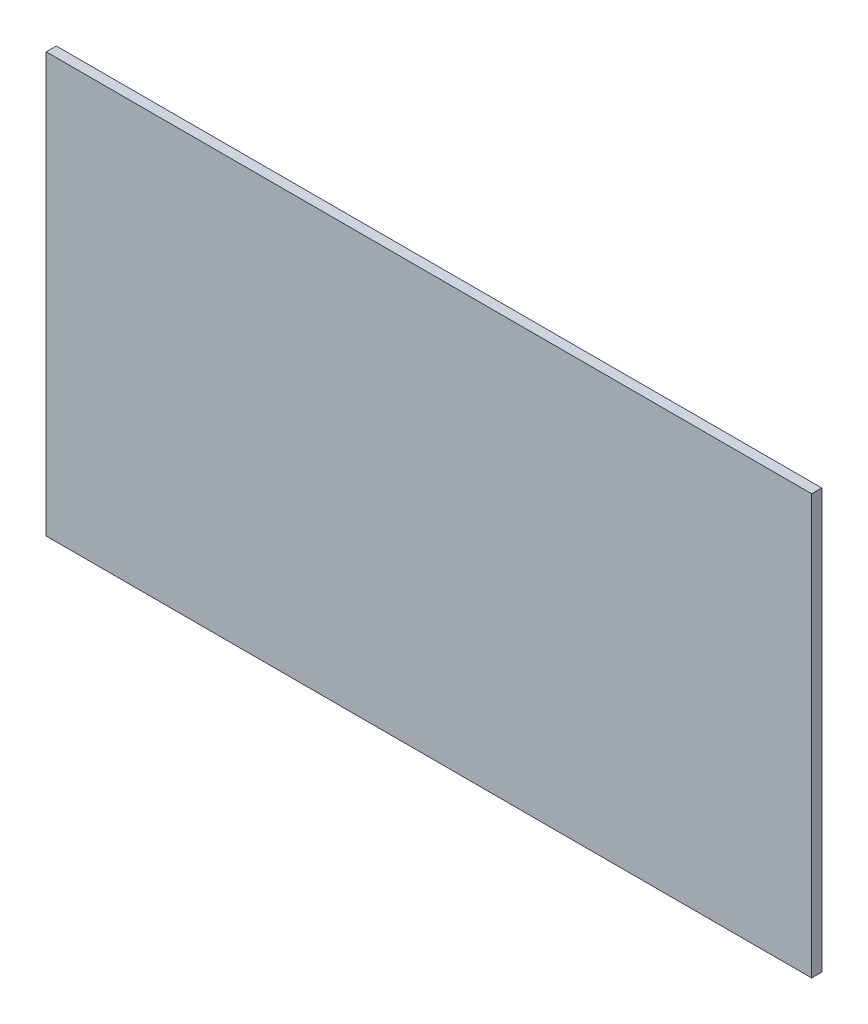
ISO-10303-21;
HEADER;
FILE_DESCRIPTION(('STEP AP214'),'2;1');
FILE_NAME('part.step','',(''),(''),'','','');
FILE_SCHEMA(('AUTOMOTIVE_DESIGN { 1 0 10303 214 1 1 1 1 }'));
ENDSEC;
DATA;
#1=APPLICATION_CONTEXT('core data for automotive mechanical design processes');
#2=APPLICATION_PROTOCOL_DEFINITION('international standard','automotive_design',2000,#1);
#3=PRODUCT_CONTEXT('',#1,'mechanical');
#4=PRODUCT('Part','Part','',(#3));
#5=PRODUCT_RELATED_PRODUCT_CATEGORY('part','',(#4));
#6=PRODUCT_DEFINITION_FORMATION('','',#4);
#7=PRODUCT_DEFINITION_CONTEXT('part definition',#1,'design');
#8=PRODUCT_DEFINITION('design','',#6,#7);
#9=PRODUCT_DEFINITION_SHAPE('','',#8);
#10=(LENGTH_UNIT() NAMED_UNIT(*) SI_UNIT(.MILLI.,.METRE.));
#11=(NAMED_UNIT(*) PLANE_ANGLE_UNIT() SI_UNIT($,.RADIAN.));
#12=(NAMED_UNIT(*) SI_UNIT($,.STERADIAN.) SOLID_ANGLE_UNIT());
#13=UNCERTAINTY_MEASURE_WITH_UNIT(LENGTH_MEASURE(1.E-05),#10,'distance_accuracy_value','');
#14=(GEOMETRIC_REPRESENTATION_CONTEXT(3) GLOBAL_UNCERTAINTY_ASSIGNED_CONTEXT((#13)) GLOBAL_UNIT_ASSIGNED_CONTEXT((#10,
#11,#12)) REPRESENTATION_CONTEXT('',''));
#15=CARTESIAN_POINT('',(0.,0.,0.));
#16=DIRECTION('',(0.,0.,1.));
#17=DIRECTION('',(1.,0.,0.));
#18=AXIS2_PLACEMENT_3D('',#15,#16,#17);
#19=CARTESIAN_POINT('',(0.,0.,2.));
#20=DIRECTION('',(1.,0.,0.));
#21=DIRECTION('',(0.,0.,-1.));
#22=AXIS2_PLACEMENT_3D('',#19,#20,#21);
#23=PLANE('',#22);
#24=DIRECTION('',(0.,-1.,0.));
#25=VECTOR('',#24,1.);
#26=CARTESIAN_POINT('',(0.,0.,0.));
#27=LINE('',#26,#25);
#28=CARTESIAN_POINT('',(0.,83.,0.));
#29=VERTEX_POINT('',#28);
#30=CARTESIAN_POINT('',(0.,0.,0.));
#31=VERTEX_POINT('',#30);
#32=EDGE_CURVE('E97',#29,#31,#27,.T.);
#33=ORIENTED_EDGE('',*,*,#32,.T.);
#34=DIRECTION('',(0.,0.,-1.));
#35=VECTOR('',#34,1.);
#36=CARTESIAN_POINT('',(0.,0.,2.));
#37=LINE('',#36,#35);
#38=CARTESIAN_POINT('',(0.,0.,2.));
#39=VERTEX_POINT('',#38);
#40=EDGE_CURVE('E11',#39,#31,#37,.T.);
#41=ORIENTED_EDGE('',*,*,#40,.F.);
#42=DIRECTION('',(0.,-1.,0.));
#43=VECTOR('',#42,1.);
#44=CARTESIAN_POINT('',(0.,0.,2.));
#45=LINE('',#44,#43);
#46=CARTESIAN_POINT('',(0.,83.,2.));
#47=VERTEX_POINT('',#46);
#48=EDGE_CURVE('E85',#47,#39,#45,.T.);
#49=ORIENTED_EDGE('',*,*,#48,.F.);
#50=DIRECTION('',(0.,0.,-1.));
#51=VECTOR('',#50,1.);
#52=CARTESIAN_POINT('',(0.,83.,2.));
#53=LINE('',#52,#51);
#54=EDGE_CURVE('E93',#47,#29,#53,.T.);
#55=ORIENTED_EDGE('',*,*,#54,.T.);
#56=EDGE_LOOP('',(#33,#41,#49,#55));
#57=FACE_BOUND('',#56,.T.);
#58=ADVANCED_FACE('F34',(#57),#23,.F.);
#59=CARTESIAN_POINT('',(0.,0.,2.));
#60=DIRECTION('',(0.,1.,0.));
#61=DIRECTION('',(0.,0.,1.));
#62=AXIS2_PLACEMENT_3D('',#59,#60,#61);
#63=PLANE('',#62);
#64=DIRECTION('',(1.,0.,0.));
#65=VECTOR('',#64,1.);
#66=CARTESIAN_POINT('',(0.,0.,0.));
#67=LINE('',#66,#65);
#68=CARTESIAN_POINT('',(151.5,0.,0.));
#69=VERTEX_POINT('',#68);
#70=EDGE_CURVE('E89',#31,#69,#67,.T.);
#71=ORIENTED_EDGE('',*,*,#70,.T.);
#72=DIRECTION('',(0.,0.,-1.));
#73=VECTOR('',#72,1.);
#74=CARTESIAN_POINT('',(151.5,0.,2.));
#75=LINE('',#74,#73);
#76=CARTESIAN_POINT('',(151.5,0.,2.));
#77=VERTEX_POINT('',#76);
#78=EDGE_CURVE('E42',#77,#69,#75,.T.);
#79=ORIENTED_EDGE('',*,*,#78,.F.);
#80=DIRECTION('',(1.,0.,0.));
#81=VECTOR('',#80,1.);
#82=CARTESIAN_POINT('',(0.,0.,2.));
#83=LINE('',#82,#81);
#84=EDGE_CURVE('E80',#39,#77,#83,.T.);
#85=ORIENTED_EDGE('',*,*,#84,.F.);
#86=ORIENTED_EDGE('',*,*,#40,.T.);
#87=EDGE_LOOP('',(#71,#79,#85,#86));
#88=FACE_BOUND('',#87,.T.);
#89=ADVANCED_FACE('F88',(#88),#63,.F.);
#90=CARTESIAN_POINT('',(151.5,0.,2.));
#91=DIRECTION('',(-1.,0.,0.));
#92=DIRECTION('',(0.,0.,1.));
#93=AXIS2_PLACEMENT_3D('',#90,#91,#92);
#94=PLANE('',#93);
#95=DIRECTION('',(0.,1.,0.));
#96=VECTOR('',#95,1.);
#97=CARTESIAN_POINT('',(151.5,0.,0.));
#98=LINE('',#97,#96);
#99=CARTESIAN_POINT('',(151.5,83.,0.));
#100=VERTEX_POINT('',#99);
#101=EDGE_CURVE('E67',#69,#100,#98,.T.);
#102=ORIENTED_EDGE('',*,*,#101,.T.);
#103=DIRECTION('',(0.,0.,-1.));
#104=VECTOR('',#103,1.);
#105=CARTESIAN_POINT('',(151.5,83.,2.));
#106=LINE('',#105,#104);
#107=CARTESIAN_POINT('',(151.5,83.,2.));
#108=VERTEX_POINT('',#107);
#109=EDGE_CURVE('E90',#108,#100,#106,.T.);
#110=ORIENTED_EDGE('',*,*,#109,.F.);
#111=DIRECTION('',(0.,1.,0.));
#112=VECTOR('',#111,1.);
#113=CARTESIAN_POINT('',(151.5,0.,2.));
#114=LINE('',#113,#112);
#115=EDGE_CURVE('E83',#77,#108,#114,.T.);
#116=ORIENTED_EDGE('',*,*,#115,.F.);
#117=ORIENTED_EDGE('',*,*,#78,.T.);
#118=EDGE_LOOP('',(#102,#110,#116,#117));
#119=FACE_BOUND('',#118,.T.);
#120=ADVANCED_FACE('F91',(#119),#94,.F.);
#121=CARTESIAN_POINT('',(0.,83.,2.));
#122=DIRECTION('',(0.,-1.,0.));
#123=DIRECTION('',(0.,0.,-1.));
#124=AXIS2_PLACEMENT_3D('',#121,#122,#123);
#125=PLANE('',#124);
#126=DIRECTION('',(-1.,0.,0.));
#127=VECTOR('',#126,1.);
#128=CARTESIAN_POINT('',(0.,83.,0.));
#129=LINE('',#128,#127);
#130=EDGE_CURVE('E73',#100,#29,#129,.T.);
#131=ORIENTED_EDGE('',*,*,#130,.T.);
#132=ORIENTED_EDGE('',*,*,#54,.F.);
#133=DIRECTION('',(-1.,0.,0.));
#134=VECTOR('',#133,1.);
#135=CARTESIAN_POINT('',(0.,83.,2.));
#136=LINE('',#135,#134);
#137=EDGE_CURVE('E50',#108,#47,#136,.T.);
#138=ORIENTED_EDGE('',*,*,#137,.F.);
#139=ORIENTED_EDGE('',*,*,#109,.T.);
#140=EDGE_LOOP('',(#131,#132,#138,#139));
#141=FACE_BOUND('',#140,.T.);
#142=ADVANCED_FACE('F104',(#141),#125,.F.);
#143=CARTESIAN_POINT('',(0.,0.,2.));
#144=DIRECTION('',(0.,0.,-1.));
#145=DIRECTION('',(-1.,0.,0.));
#146=AXIS2_PLACEMENT_3D('',#143,#144,#145);
#147=PLANE('',#146);
#148=ORIENTED_EDGE('',*,*,#48,.T.);
#149=ORIENTED_EDGE('',*,*,#84,.T.);
#150=ORIENTED_EDGE('',*,*,#115,.T.);
#151=ORIENTED_EDGE('',*,*,#137,.T.);
#152=EDGE_LOOP('',(#148,#149,#150,#151));
#153=FACE_BOUND('',#152,.T.);
#154=ADVANCED_FACE('F81',(#153),#147,.F.);
#155=CARTESIAN_POINT('',(0.,0.,0.));
#156=DIRECTION('',(0.,0.,-1.));
#157=DIRECTION('',(-1.,0.,0.));
#158=AXIS2_PLACEMENT_3D('',#155,#156,#157);
#159=PLANE('',#158);
#160=ORIENTED_EDGE('',*,*,#32,.F.);
#161=ORIENTED_EDGE('',*,*,#130,.F.);
#162=ORIENTED_EDGE('',*,*,#101,.F.);
#163=ORIENTED_EDGE('',*,*,#70,.F.);
#164=EDGE_LOOP('',(#160,#161,#162,#163));
#165=FACE_BOUND('',#164,.T.);
#166=ADVANCED_FACE('F107',(#165),#159,.T.);
#167=CLOSED_SHELL('',(#58,#89,#120,#142,#154,#166));
#168=MANIFOLD_SOLID_BREP('B2',#167);
#169=ADVANCED_BREP_SHAPE_REPRESENTATION('',(#18,#168),#14);
#170=SHAPE_DEFINITION_REPRESENTATION(#9,#169);
ENDSEC;
END-ISO-10303-21;
